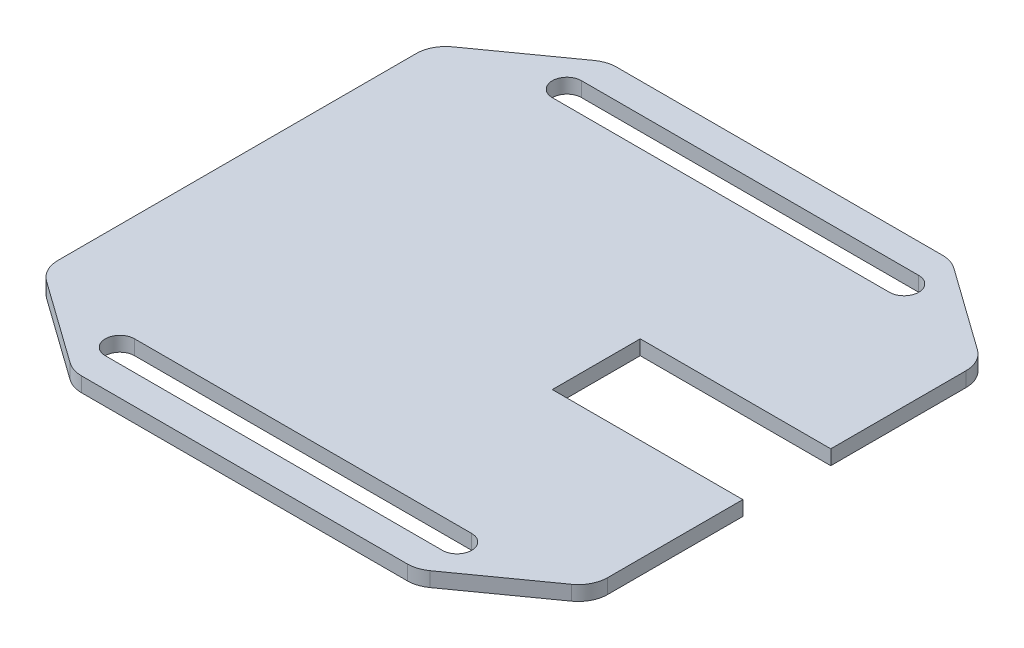
ISO-10303-21;
HEADER;
FILE_DESCRIPTION(('STEP AP214'),'2;1');
FILE_NAME('part.step','',(''),(''),'','','');
FILE_SCHEMA(('AUTOMOTIVE_DESIGN { 1 0 10303 214 1 1 1 1 }'));
ENDSEC;
DATA;
#1=APPLICATION_CONTEXT('core data for automotive mechanical design processes');
#2=APPLICATION_PROTOCOL_DEFINITION('international standard','automotive_design',2000,#1);
#3=PRODUCT_CONTEXT('',#1,'mechanical');
#4=PRODUCT('Part','Part','',(#3));
#5=PRODUCT_RELATED_PRODUCT_CATEGORY('part','',(#4));
#6=PRODUCT_DEFINITION_FORMATION('','',#4);
#7=PRODUCT_DEFINITION_CONTEXT('part definition',#1,'design');
#8=PRODUCT_DEFINITION('design','',#6,#7);
#9=PRODUCT_DEFINITION_SHAPE('','',#8);
#10=(LENGTH_UNIT() NAMED_UNIT(*) SI_UNIT(.MILLI.,.METRE.));
#11=(NAMED_UNIT(*) PLANE_ANGLE_UNIT() SI_UNIT($,.RADIAN.));
#12=(NAMED_UNIT(*) SI_UNIT($,.STERADIAN.) SOLID_ANGLE_UNIT());
#13=UNCERTAINTY_MEASURE_WITH_UNIT(LENGTH_MEASURE(1.E-05),#10,'distance_accuracy_value','');
#14=(GEOMETRIC_REPRESENTATION_CONTEXT(3) GLOBAL_UNCERTAINTY_ASSIGNED_CONTEXT((#13)) GLOBAL_UNIT_ASSIGNED_CONTEXT((#10,
#11,#12)) REPRESENTATION_CONTEXT('',''));
#15=CARTESIAN_POINT('',(0.,0.,0.));
#16=DIRECTION('',(0.,0.,1.));
#17=DIRECTION('',(1.,0.,0.));
#18=AXIS2_PLACEMENT_3D('',#15,#16,#17);
#19=CARTESIAN_POINT('',(18.75,1.,-18.25));
#20=DIRECTION('',(-1.,0.,0.));
#21=DIRECTION('',(0.,0.,1.));
#22=AXIS2_PLACEMENT_3D('',#19,#20,#21);
#23=PLANE('',#22);
#24=DIRECTION('',(0.,0.,-1.));
#25=VECTOR('',#24,1.);
#26=CARTESIAN_POINT('',(18.75,0.,-18.25));
#27=LINE('',#26,#25);
#28=CARTESIAN_POINT('',(18.75,0.,12.2207642094164));
#29=VERTEX_POINT('',#28);
#30=CARTESIAN_POINT('',(18.75,0.,3.));
#31=VERTEX_POINT('',#30);
#32=EDGE_CURVE('E249',#29,#31,#27,.T.);
#33=ORIENTED_EDGE('',*,*,#32,.T.);
#34=DIRECTION('',(0.,1.,0.));
#35=VECTOR('',#34,1.);
#36=CARTESIAN_POINT('',(18.75,0.,3.));
#37=LINE('',#36,#35);
#38=CARTESIAN_POINT('',(18.75,1.,3.));
#39=VERTEX_POINT('',#38);
#40=EDGE_CURVE('E404',#31,#39,#37,.T.);
#41=ORIENTED_EDGE('',*,*,#40,.T.);
#42=DIRECTION('',(0.,0.,-1.));
#43=VECTOR('',#42,1.);
#44=CARTESIAN_POINT('',(18.75,1.,-18.25));
#45=LINE('',#44,#43);
#46=CARTESIAN_POINT('',(18.75,1.,12.2207642094164));
#47=VERTEX_POINT('',#46);
#48=EDGE_CURVE('E364',#47,#39,#45,.T.);
#49=ORIENTED_EDGE('',*,*,#48,.F.);
#50=DIRECTION('',(0.,1.,0.));
#51=VECTOR('',#50,1.);
#52=CARTESIAN_POINT('',(18.75,1.,12.2207642094164));
#53=LINE('',#52,#51);
#54=EDGE_CURVE('E320',#47,#29,#53,.F.);
#55=ORIENTED_EDGE('',*,*,#54,.T.);
#56=EDGE_LOOP('',(#33,#41,#49,#55));
#57=FACE_BOUND('',#56,.T.);
#58=ADVANCED_FACE('F38',(#57),#23,.F.);
#59=CARTESIAN_POINT('',(18.75,1.,-3.));
#60=VERTEX_POINT('',#59);
#61=CARTESIAN_POINT('',(18.75,1.,-12.2207642094164));
#62=VERTEX_POINT('',#61);
#63=EDGE_CURVE('E241',#60,#62,#45,.T.);
#64=ORIENTED_EDGE('',*,*,#63,.F.);
#65=DIRECTION('',(0.,1.,0.));
#66=VECTOR('',#65,1.);
#67=CARTESIAN_POINT('',(18.75,0.,-3.));
#68=LINE('',#67,#66);
#69=CARTESIAN_POINT('',(18.75,0.,-3.));
#70=VERTEX_POINT('',#69);
#71=EDGE_CURVE('E228',#70,#60,#68,.T.);
#72=ORIENTED_EDGE('',*,*,#71,.F.);
#73=CARTESIAN_POINT('',(18.75,0.,-12.2207642094164));
#74=VERTEX_POINT('',#73);
#75=EDGE_CURVE('E239',#70,#74,#27,.T.);
#76=ORIENTED_EDGE('',*,*,#75,.T.);
#77=DIRECTION('',(0.,1.,0.));
#78=VECTOR('',#77,1.);
#79=CARTESIAN_POINT('',(18.75,1.,-12.2207642094164));
#80=LINE('',#79,#78);
#81=EDGE_CURVE('E322',#74,#62,#80,.T.);
#82=ORIENTED_EDGE('',*,*,#81,.T.);
#83=EDGE_LOOP('',(#64,#72,#76,#82));
#84=FACE_BOUND('',#83,.T.);
#85=ADVANCED_FACE('F237',(#84),#23,.F.);
#86=CARTESIAN_POINT('',(-18.75,1.,-18.25));
#87=DIRECTION('',(0.,0.,1.));
#88=DIRECTION('',(1.,0.,0.));
#89=AXIS2_PLACEMENT_3D('',#86,#87,#88);
#90=PLANE('',#89);
#91=DIRECTION('',(-1.,0.,0.));
#92=VECTOR('',#91,1.);
#93=CARTESIAN_POINT('',(-18.75,0.,-18.25));
#94=LINE('',#93,#92);
#95=CARTESIAN_POINT('',(11.1090698931829,0.,-18.25));
#96=VERTEX_POINT('',#95);
#97=CARTESIAN_POINT('',(-11.1090698931829,0.,-18.25));
#98=VERTEX_POINT('',#97);
#99=EDGE_CURVE('E253',#96,#98,#94,.T.);
#100=ORIENTED_EDGE('',*,*,#99,.T.);
#101=DIRECTION('',(0.,1.,0.));
#102=VECTOR('',#101,1.);
#103=CARTESIAN_POINT('',(-11.1090698931829,1.,-18.25));
#104=LINE('',#103,#102);
#105=CARTESIAN_POINT('',(-11.1090698931829,1.,-18.25));
#106=VERTEX_POINT('',#105);
#107=EDGE_CURVE('E312',#98,#106,#104,.T.);
#108=ORIENTED_EDGE('',*,*,#107,.T.);
#109=DIRECTION('',(-1.,0.,0.));
#110=VECTOR('',#109,1.);
#111=CARTESIAN_POINT('',(-18.75,1.,-18.25));
#112=LINE('',#111,#110);
#113=CARTESIAN_POINT('',(11.1090698931829,1.,-18.25));
#114=VERTEX_POINT('',#113);
#115=EDGE_CURVE('E361',#114,#106,#112,.T.);
#116=ORIENTED_EDGE('',*,*,#115,.F.);
#117=DIRECTION('',(0.,1.,0.));
#118=VECTOR('',#117,1.);
#119=CARTESIAN_POINT('',(11.1090698931829,1.,-18.25));
#120=LINE('',#119,#118);
#121=EDGE_CURVE('E310',#114,#96,#120,.F.);
#122=ORIENTED_EDGE('',*,*,#121,.T.);
#123=EDGE_LOOP('',(#100,#108,#116,#122));
#124=FACE_BOUND('',#123,.T.);
#125=ADVANCED_FACE('F492',(#124),#90,.F.);
#126=CARTESIAN_POINT('',(-18.75,1.,-18.25));
#127=DIRECTION('',(1.,0.,0.));
#128=DIRECTION('',(0.,0.,-1.));
#129=AXIS2_PLACEMENT_3D('',#126,#127,#128);
#130=PLANE('',#129);
#131=DIRECTION('',(0.,0.,1.));
#132=VECTOR('',#131,1.);
#133=CARTESIAN_POINT('',(-18.75,1.,-18.25));
#134=LINE('',#133,#132);
#135=CARTESIAN_POINT('',(-18.75,1.,-12.2207642094164));
#136=VERTEX_POINT('',#135);
#137=CARTESIAN_POINT('',(-18.75,1.,12.2207642094164));
#138=VERTEX_POINT('',#137);
#139=EDGE_CURVE('E354',#136,#138,#134,.T.);
#140=ORIENTED_EDGE('',*,*,#139,.F.);
#141=DIRECTION('',(0.,1.,0.));
#142=VECTOR('',#141,1.);
#143=CARTESIAN_POINT('',(-18.75,1.,-12.2207642094164));
#144=LINE('',#143,#142);
#145=CARTESIAN_POINT('',(-18.75,0.,-12.2207642094164));
#146=VERTEX_POINT('',#145);
#147=EDGE_CURVE('E293',#136,#146,#144,.F.);
#148=ORIENTED_EDGE('',*,*,#147,.T.);
#149=DIRECTION('',(0.,0.,1.));
#150=VECTOR('',#149,1.);
#151=CARTESIAN_POINT('',(-18.75,0.,-18.25));
#152=LINE('',#151,#150);
#153=CARTESIAN_POINT('',(-18.75,0.,12.2207642094164));
#154=VERTEX_POINT('',#153);
#155=EDGE_CURVE('E263',#146,#154,#152,.T.);
#156=ORIENTED_EDGE('',*,*,#155,.T.);
#157=DIRECTION('',(0.,1.,0.));
#158=VECTOR('',#157,1.);
#159=CARTESIAN_POINT('',(-18.75,1.,12.2207642094164));
#160=LINE('',#159,#158);
#161=EDGE_CURVE('E290',#154,#138,#160,.T.);
#162=ORIENTED_EDGE('',*,*,#161,.T.);
#163=EDGE_LOOP('',(#140,#148,#156,#162));
#164=FACE_BOUND('',#163,.T.);
#165=ADVANCED_FACE('F353',(#164),#130,.F.);
#166=CARTESIAN_POINT('',(-18.75,1.,18.25));
#167=DIRECTION('',(0.,0.,-1.));
#168=DIRECTION('',(-1.,0.,0.));
#169=AXIS2_PLACEMENT_3D('',#166,#167,#168);
#170=PLANE('',#169);
#171=DIRECTION('',(1.,0.,0.));
#172=VECTOR('',#171,1.);
#173=CARTESIAN_POINT('',(-18.75,0.,18.25));
#174=LINE('',#173,#172);
#175=CARTESIAN_POINT('',(-11.1090698931829,0.,18.25));
#176=VERTEX_POINT('',#175);
#177=CARTESIAN_POINT('',(11.1090698931829,0.,18.25));
#178=VERTEX_POINT('',#177);
#179=EDGE_CURVE('E266',#176,#178,#174,.T.);
#180=ORIENTED_EDGE('',*,*,#179,.T.);
#181=DIRECTION('',(0.,1.,0.));
#182=VECTOR('',#181,1.);
#183=CARTESIAN_POINT('',(11.1090698931829,1.,18.25));
#184=LINE('',#183,#182);
#185=CARTESIAN_POINT('',(11.1090698931829,1.,18.25));
#186=VERTEX_POINT('',#185);
#187=EDGE_CURVE('E330',#178,#186,#184,.T.);
#188=ORIENTED_EDGE('',*,*,#187,.T.);
#189=DIRECTION('',(1.,0.,0.));
#190=VECTOR('',#189,1.);
#191=CARTESIAN_POINT('',(-18.75,1.,18.25));
#192=LINE('',#191,#190);
#193=CARTESIAN_POINT('',(-11.1090698931829,1.,18.25));
#194=VERTEX_POINT('',#193);
#195=EDGE_CURVE('E259',#194,#186,#192,.T.);
#196=ORIENTED_EDGE('',*,*,#195,.F.);
#197=DIRECTION('',(0.,1.,0.));
#198=VECTOR('',#197,1.);
#199=CARTESIAN_POINT('',(-11.1090698931829,1.,18.25));
#200=LINE('',#199,#198);
#201=EDGE_CURVE('E328',#194,#176,#200,.F.);
#202=ORIENTED_EDGE('',*,*,#201,.T.);
#203=EDGE_LOOP('',(#180,#188,#196,#202));
#204=FACE_BOUND('',#203,.T.);
#205=ADVANCED_FACE('F476',(#204),#170,.F.);
#206=CARTESIAN_POINT('',(0.,1.,0.));
#207=DIRECTION('',(0.,1.,0.));
#208=DIRECTION('',(0.,0.,1.));
#209=AXIS2_PLACEMENT_3D('',#206,#207,#208);
#210=PLANE('',#209);
#211=DIRECTION('',(1.,0.,0.));
#212=VECTOR('',#211,1.);
#213=CARTESIAN_POINT('',(5.75,1.,3.));
#214=LINE('',#213,#212);
#215=CARTESIAN_POINT('',(5.75,1.,3.));
#216=VERTEX_POINT('',#215);
#217=EDGE_CURVE('E233',#216,#39,#214,.T.);
#218=ORIENTED_EDGE('',*,*,#217,.F.);
#219=DIRECTION('',(0.,0.,1.));
#220=VECTOR('',#219,1.);
#221=CARTESIAN_POINT('',(5.75,1.,-3.));
#222=LINE('',#221,#220);
#223=CARTESIAN_POINT('',(5.75,1.,-3.));
#224=VERTEX_POINT('',#223);
#225=EDGE_CURVE('E451',#224,#216,#222,.T.);
#226=ORIENTED_EDGE('',*,*,#225,.F.);
#227=DIRECTION('',(-1.,0.,0.));
#228=VECTOR('',#227,1.);
#229=CARTESIAN_POINT('',(5.75,1.,-3.));
#230=LINE('',#229,#228);
#231=EDGE_CURVE('E454',#60,#224,#230,.T.);
#232=ORIENTED_EDGE('',*,*,#231,.F.);
#233=ORIENTED_EDGE('',*,*,#63,.T.);
#234=CARTESIAN_POINT('',(16.75,1.,-12.2207642094164));
#235=DIRECTION('',(0.,1.,0.));
#236=DIRECTION('',(0.,0.,1.));
#237=AXIS2_PLACEMENT_3D('',#234,#235,#236);
#238=CIRCLE('',#237,2.);
#239=CARTESIAN_POINT('',(17.9124763874382,1.,-13.8482311518299));
#240=VERTEX_POINT('',#239);
#241=EDGE_CURVE('E282',#62,#240,#238,.T.);
#242=ORIENTED_EDGE('',*,*,#241,.T.);
#243=DIRECTION('',(0.813733471206735,0.,0.581238193719096));
#244=VECTOR('',#243,1.);
#245=CARTESIAN_POINT('',(11.75,1.,-18.25));
#246=LINE('',#245,#244);
#247=CARTESIAN_POINT('',(12.2715462806211,1.,-17.8774669424135));
#248=VERTEX_POINT('',#247);
#249=EDGE_CURVE('E377',#248,#240,#246,.T.);
#250=ORIENTED_EDGE('',*,*,#249,.F.);
#251=CARTESIAN_POINT('',(11.1090698931829,1.,-16.25));
#252=DIRECTION('',(0.,1.,0.));
#253=DIRECTION('',(0.,0.,1.));
#254=AXIS2_PLACEMENT_3D('',#251,#252,#253);
#255=CIRCLE('',#254,2.);
#256=EDGE_CURVE('E284',#248,#114,#255,.T.);
#257=ORIENTED_EDGE('',*,*,#256,.T.);
#258=ORIENTED_EDGE('',*,*,#115,.T.);
#259=CARTESIAN_POINT('',(-11.1090698931829,1.,-16.25));
#260=DIRECTION('',(0.,1.,0.));
#261=DIRECTION('',(0.,0.,1.));
#262=AXIS2_PLACEMENT_3D('',#259,#260,#261);
#263=CIRCLE('',#262,2.);
#264=CARTESIAN_POINT('',(-12.2715462806211,1.,-17.8774669424135));
#265=VERTEX_POINT('',#264);
#266=EDGE_CURVE('E286',#106,#265,#263,.T.);
#267=ORIENTED_EDGE('',*,*,#266,.T.);
#268=DIRECTION('',(0.813733471206735,0.,-0.581238193719096));
#269=VECTOR('',#268,1.);
#270=CARTESIAN_POINT('',(-11.75,1.,-18.25));
#271=LINE('',#270,#269);
#272=CARTESIAN_POINT('',(-17.9124763874382,1.,-13.8482311518299));
#273=VERTEX_POINT('',#272);
#274=EDGE_CURVE('E255',#273,#265,#271,.T.);
#275=ORIENTED_EDGE('',*,*,#274,.F.);
#276=CARTESIAN_POINT('',(-16.75,1.,-12.2207642094164));
#277=DIRECTION('',(0.,1.,0.));
#278=DIRECTION('',(0.,0.,1.));
#279=AXIS2_PLACEMENT_3D('',#276,#277,#278);
#280=CIRCLE('',#279,2.);
#281=EDGE_CURVE('E288',#273,#136,#280,.T.);
#282=ORIENTED_EDGE('',*,*,#281,.T.);
#283=ORIENTED_EDGE('',*,*,#139,.T.);
#284=CARTESIAN_POINT('',(-16.75,1.,12.2207642094164));
#285=DIRECTION('',(0.,1.,0.));
#286=DIRECTION('',(0.,0.,1.));
#287=AXIS2_PLACEMENT_3D('',#284,#285,#286);
#288=CIRCLE('',#287,2.);
#289=CARTESIAN_POINT('',(-17.9124763874382,1.,13.8482311518299));
#290=VERTEX_POINT('',#289);
#291=EDGE_CURVE('E274',#138,#290,#288,.T.);
#292=ORIENTED_EDGE('',*,*,#291,.T.);
#293=DIRECTION('',(-0.813733471206735,0.,-0.581238193719096));
#294=VECTOR('',#293,1.);
#295=CARTESIAN_POINT('',(-11.75,1.,18.25));
#296=LINE('',#295,#294);
#297=CARTESIAN_POINT('',(-12.2715462806211,1.,17.8774669424135));
#298=VERTEX_POINT('',#297);
#299=EDGE_CURVE('E341',#298,#290,#296,.T.);
#300=ORIENTED_EDGE('',*,*,#299,.F.);
#301=CARTESIAN_POINT('',(-11.1090698931829,1.,16.25));
#302=DIRECTION('',(0.,1.,0.));
#303=DIRECTION('',(0.,0.,1.));
#304=AXIS2_PLACEMENT_3D('',#301,#302,#303);
#305=CIRCLE('',#304,2.);
#306=EDGE_CURVE('E276',#298,#194,#305,.T.);
#307=ORIENTED_EDGE('',*,*,#306,.T.);
#308=ORIENTED_EDGE('',*,*,#195,.T.);
#309=CARTESIAN_POINT('',(11.1090698931829,1.,16.25));
#310=DIRECTION('',(0.,1.,0.));
#311=DIRECTION('',(0.,0.,1.));
#312=AXIS2_PLACEMENT_3D('',#309,#310,#311);
#313=CIRCLE('',#312,2.);
#314=CARTESIAN_POINT('',(12.2715462806211,1.,17.8774669424135));
#315=VERTEX_POINT('',#314);
#316=EDGE_CURVE('E278',#186,#315,#313,.T.);
#317=ORIENTED_EDGE('',*,*,#316,.T.);
#318=DIRECTION('',(-0.813733471206735,0.,0.581238193719096));
#319=VECTOR('',#318,1.);
#320=CARTESIAN_POINT('',(11.75,1.,18.25));
#321=LINE('',#320,#319);
#322=CARTESIAN_POINT('',(17.9124763874382,1.,13.8482311518299));
#323=VERTEX_POINT('',#322);
#324=EDGE_CURVE('E347',#323,#315,#321,.T.);
#325=ORIENTED_EDGE('',*,*,#324,.F.);
#326=CARTESIAN_POINT('',(16.75,1.,12.2207642094164));
#327=DIRECTION('',(0.,1.,0.));
#328=DIRECTION('',(0.,0.,1.));
#329=AXIS2_PLACEMENT_3D('',#326,#327,#328);
#330=CIRCLE('',#329,2.);
#331=EDGE_CURVE('E280',#323,#47,#330,.T.);
#332=ORIENTED_EDGE('',*,*,#331,.T.);
#333=ORIENTED_EDGE('',*,*,#48,.T.);
#334=EDGE_LOOP('',(#218,#226,#232,#233,#242,#250,#257,#258,#267,#275,#282,#283,#292,#300,#307,
#308,#317,#325,#332,#333));
#335=FACE_BOUND('',#334,.T.);
#336=CARTESIAN_POINT('',(-11.5,1.,-15.25));
#337=DIRECTION('',(0.,1.,0.));
#338=DIRECTION('',(0.,0.,1.));
#339=AXIS2_PLACEMENT_3D('',#336,#337,#338);
#340=CIRCLE('',#339,0.999999999999997);
#341=CARTESIAN_POINT('',(-11.5,1.,-16.25));
#342=VERTEX_POINT('',#341);
#343=CARTESIAN_POINT('',(-11.5,1.,-14.25));
#344=VERTEX_POINT('',#343);
#345=EDGE_CURVE('E391',#342,#344,#340,.T.);
#346=ORIENTED_EDGE('',*,*,#345,.F.);
#347=DIRECTION('',(-1.,0.,0.));
#348=VECTOR('',#347,1.);
#349=CARTESIAN_POINT('',(-11.5,1.,-16.25));
#350=LINE('',#349,#348);
#351=CARTESIAN_POINT('',(11.5,1.,-16.25));
#352=VERTEX_POINT('',#351);
#353=EDGE_CURVE('E424',#352,#342,#350,.T.);
#354=ORIENTED_EDGE('',*,*,#353,.F.);
#355=CARTESIAN_POINT('',(11.5,1.,-15.25));
#356=DIRECTION('',(0.,1.,0.));
#357=DIRECTION('',(0.,0.,1.));
#358=AXIS2_PLACEMENT_3D('',#355,#356,#357);
#359=CIRCLE('',#358,0.999999999999997);
#360=CARTESIAN_POINT('',(11.5,1.,-14.25));
#361=VERTEX_POINT('',#360);
#362=EDGE_CURVE('E428',#361,#352,#359,.T.);
#363=ORIENTED_EDGE('',*,*,#362,.F.);
#364=DIRECTION('',(1.,0.,0.));
#365=VECTOR('',#364,1.);
#366=CARTESIAN_POINT('',(-11.5,1.,-14.25));
#367=LINE('',#366,#365);
#368=EDGE_CURVE('E431',#344,#361,#367,.T.);
#369=ORIENTED_EDGE('',*,*,#368,.F.);
#370=EDGE_LOOP('',(#346,#354,#363,#369));
#371=FACE_BOUND('',#370,.T.);
#372=CARTESIAN_POINT('',(-11.5,1.,15.25));
#373=DIRECTION('',(0.,1.,0.));
#374=DIRECTION('',(0.,0.,-1.));
#375=AXIS2_PLACEMENT_3D('',#372,#373,#374);
#376=CIRCLE('',#375,0.999999999999997);
#377=CARTESIAN_POINT('',(-11.5,1.,14.25));
#378=VERTEX_POINT('',#377);
#379=CARTESIAN_POINT('',(-11.5,1.,16.25));
#380=VERTEX_POINT('',#379);
#381=EDGE_CURVE('E402',#378,#380,#376,.T.);
#382=ORIENTED_EDGE('',*,*,#381,.F.);
#383=DIRECTION('',(-1.,0.,0.));
#384=VECTOR('',#383,1.);
#385=CARTESIAN_POINT('',(-11.5,1.,14.25));
#386=LINE('',#385,#384);
#387=CARTESIAN_POINT('',(11.5,1.,14.25));
#388=VERTEX_POINT('',#387);
#389=EDGE_CURVE('E392',#388,#378,#386,.T.);
#390=ORIENTED_EDGE('',*,*,#389,.F.);
#391=CARTESIAN_POINT('',(11.5,1.,15.25));
#392=DIRECTION('',(0.,1.,0.));
#393=DIRECTION('',(0.,0.,-1.));
#394=AXIS2_PLACEMENT_3D('',#391,#392,#393);
#395=CIRCLE('',#394,0.999999999999997);
#396=CARTESIAN_POINT('',(11.5,1.,16.25));
#397=VERTEX_POINT('',#396);
#398=EDGE_CURVE('E396',#397,#388,#395,.T.);
#399=ORIENTED_EDGE('',*,*,#398,.F.);
#400=DIRECTION('',(1.,0.,0.));
#401=VECTOR('',#400,1.);
#402=CARTESIAN_POINT('',(-11.5,1.,16.25));
#403=LINE('',#402,#401);
#404=EDGE_CURVE('E399',#380,#397,#403,.T.);
#405=ORIENTED_EDGE('',*,*,#404,.F.);
#406=EDGE_LOOP('',(#382,#390,#399,#405));
#407=FACE_BOUND('',#406,.T.);
#408=ADVANCED_FACE('F358',(#335,#371,#407),#210,.T.);
#409=CARTESIAN_POINT('',(0.,0.,0.));
#410=DIRECTION('',(0.,1.,0.));
#411=DIRECTION('',(0.,0.,1.));
#412=AXIS2_PLACEMENT_3D('',#409,#410,#411);
#413=PLANE('',#412);
#414=DIRECTION('',(-1.,0.,0.));
#415=VECTOR('',#414,1.);
#416=CARTESIAN_POINT('',(-11.5,0.,-16.25));
#417=LINE('',#416,#415);
#418=CARTESIAN_POINT('',(11.5,0.,-16.25));
#419=VERTEX_POINT('',#418);
#420=CARTESIAN_POINT('',(-11.5,0.,-16.25));
#421=VERTEX_POINT('',#420);
#422=EDGE_CURVE('E419',#419,#421,#417,.T.);
#423=ORIENTED_EDGE('',*,*,#422,.T.);
#424=CARTESIAN_POINT('',(-11.5,0.,-15.25));
#425=DIRECTION('',(0.,1.,0.));
#426=DIRECTION('',(0.,0.,1.));
#427=AXIS2_PLACEMENT_3D('',#424,#425,#426);
#428=CIRCLE('',#427,0.999999999999997);
#429=CARTESIAN_POINT('',(-11.5,0.,-14.25));
#430=VERTEX_POINT('',#429);
#431=EDGE_CURVE('E427',#421,#430,#428,.T.);
#432=ORIENTED_EDGE('',*,*,#431,.T.);
#433=DIRECTION('',(1.,0.,0.));
#434=VECTOR('',#433,1.);
#435=CARTESIAN_POINT('',(-11.5,0.,-14.25));
#436=LINE('',#435,#434);
#437=CARTESIAN_POINT('',(11.5,0.,-14.25));
#438=VERTEX_POINT('',#437);
#439=EDGE_CURVE('E440',#430,#438,#436,.T.);
#440=ORIENTED_EDGE('',*,*,#439,.T.);
#441=CARTESIAN_POINT('',(11.5,0.,-15.25));
#442=DIRECTION('',(0.,1.,0.));
#443=DIRECTION('',(0.,0.,1.));
#444=AXIS2_PLACEMENT_3D('',#441,#442,#443);
#445=CIRCLE('',#444,0.999999999999997);
#446=EDGE_CURVE('E437',#438,#419,#445,.T.);
#447=ORIENTED_EDGE('',*,*,#446,.T.);
#448=EDGE_LOOP('',(#423,#432,#440,#447));
#449=FACE_BOUND('',#448,.T.);
#450=DIRECTION('',(-1.,0.,0.));
#451=VECTOR('',#450,1.);
#452=CARTESIAN_POINT('',(-11.5,0.,14.25));
#453=LINE('',#452,#451);
#454=CARTESIAN_POINT('',(11.5,0.,14.25));
#455=VERTEX_POINT('',#454);
#456=CARTESIAN_POINT('',(-11.5,0.,14.25));
#457=VERTEX_POINT('',#456);
#458=EDGE_CURVE('E385',#455,#457,#453,.T.);
#459=ORIENTED_EDGE('',*,*,#458,.T.);
#460=CARTESIAN_POINT('',(-11.5,0.,15.25));
#461=DIRECTION('',(0.,1.,0.));
#462=DIRECTION('',(0.,0.,-1.));
#463=AXIS2_PLACEMENT_3D('',#460,#461,#462);
#464=CIRCLE('',#463,0.999999999999997);
#465=CARTESIAN_POINT('',(-11.5,0.,16.25));
#466=VERTEX_POINT('',#465);
#467=EDGE_CURVE('E395',#457,#466,#464,.T.);
#468=ORIENTED_EDGE('',*,*,#467,.T.);
#469=DIRECTION('',(1.,0.,0.));
#470=VECTOR('',#469,1.);
#471=CARTESIAN_POINT('',(-11.5,0.,16.25));
#472=LINE('',#471,#470);
#473=CARTESIAN_POINT('',(11.5,0.,16.25));
#474=VERTEX_POINT('',#473);
#475=EDGE_CURVE('E410',#466,#474,#472,.T.);
#476=ORIENTED_EDGE('',*,*,#475,.T.);
#477=CARTESIAN_POINT('',(11.5,0.,15.25));
#478=DIRECTION('',(0.,1.,0.));
#479=DIRECTION('',(0.,0.,-1.));
#480=AXIS2_PLACEMENT_3D('',#477,#478,#479);
#481=CIRCLE('',#480,0.999999999999997);
#482=EDGE_CURVE('E407',#474,#455,#481,.T.);
#483=ORIENTED_EDGE('',*,*,#482,.T.);
#484=EDGE_LOOP('',(#459,#468,#476,#483));
#485=FACE_BOUND('',#484,.T.);
#486=DIRECTION('',(0.,0.,1.));
#487=VECTOR('',#486,1.);
#488=CARTESIAN_POINT('',(5.75,0.,-3.));
#489=LINE('',#488,#487);
#490=CARTESIAN_POINT('',(5.75,0.,-3.));
#491=VERTEX_POINT('',#490);
#492=CARTESIAN_POINT('',(5.75,0.,3.));
#493=VERTEX_POINT('',#492);
#494=EDGE_CURVE('E53',#491,#493,#489,.T.);
#495=ORIENTED_EDGE('',*,*,#494,.T.);
#496=DIRECTION('',(1.,0.,0.));
#497=VECTOR('',#496,1.);
#498=CARTESIAN_POINT('',(5.75,0.,3.));
#499=LINE('',#498,#497);
#500=EDGE_CURVE('E242',#493,#31,#499,.T.);
#501=ORIENTED_EDGE('',*,*,#500,.T.);
#502=ORIENTED_EDGE('',*,*,#32,.F.);
#503=CARTESIAN_POINT('',(16.75,0.,12.2207642094164));
#504=DIRECTION('',(0.,1.,0.));
#505=DIRECTION('',(0.,0.,1.));
#506=AXIS2_PLACEMENT_3D('',#503,#504,#505);
#507=CIRCLE('',#506,2.);
#508=CARTESIAN_POINT('',(17.9124763874382,0.,13.8482311518299));
#509=VERTEX_POINT('',#508);
#510=EDGE_CURVE('E301',#29,#509,#507,.F.);
#511=ORIENTED_EDGE('',*,*,#510,.T.);
#512=DIRECTION('',(-0.813733471206735,0.,0.581238193719096));
#513=VECTOR('',#512,1.);
#514=CARTESIAN_POINT('',(11.75,0.,18.25));
#515=LINE('',#514,#513);
#516=CARTESIAN_POINT('',(12.2715462806211,0.,17.8774669424135));
#517=VERTEX_POINT('',#516);
#518=EDGE_CURVE('E375',#509,#517,#515,.T.);
#519=ORIENTED_EDGE('',*,*,#518,.T.);
#520=CARTESIAN_POINT('',(11.1090698931829,0.,16.25));
#521=DIRECTION('',(0.,1.,0.));
#522=DIRECTION('',(0.,0.,1.));
#523=AXIS2_PLACEMENT_3D('',#520,#521,#522);
#524=CIRCLE('',#523,2.);
#525=EDGE_CURVE('E299',#517,#178,#524,.F.);
#526=ORIENTED_EDGE('',*,*,#525,.T.);
#527=ORIENTED_EDGE('',*,*,#179,.F.);
#528=CARTESIAN_POINT('',(-11.1090698931829,0.,16.25));
#529=DIRECTION('',(0.,1.,0.));
#530=DIRECTION('',(0.,0.,1.));
#531=AXIS2_PLACEMENT_3D('',#528,#529,#530);
#532=CIRCLE('',#531,2.);
#533=CARTESIAN_POINT('',(-12.2715462806211,0.,17.8774669424135));
#534=VERTEX_POINT('',#533);
#535=EDGE_CURVE('E297',#176,#534,#532,.F.);
#536=ORIENTED_EDGE('',*,*,#535,.T.);
#537=DIRECTION('',(-0.813733471206735,0.,-0.581238193719096));
#538=VECTOR('',#537,1.);
#539=CARTESIAN_POINT('',(-11.75,0.,18.25));
#540=LINE('',#539,#538);
#541=CARTESIAN_POINT('',(-17.9124763874382,0.,13.8482311518299));
#542=VERTEX_POINT('',#541);
#543=EDGE_CURVE('E338',#534,#542,#540,.T.);
#544=ORIENTED_EDGE('',*,*,#543,.T.);
#545=CARTESIAN_POINT('',(-16.75,0.,12.2207642094164));
#546=DIRECTION('',(0.,1.,0.));
#547=DIRECTION('',(0.,0.,1.));
#548=AXIS2_PLACEMENT_3D('',#545,#546,#547);
#549=CIRCLE('',#548,2.);
#550=EDGE_CURVE('E295',#542,#154,#549,.F.);
#551=ORIENTED_EDGE('',*,*,#550,.T.);
#552=ORIENTED_EDGE('',*,*,#155,.F.);
#553=CARTESIAN_POINT('',(-16.75,0.,-12.2207642094164));
#554=DIRECTION('',(0.,1.,0.));
#555=DIRECTION('',(0.,0.,1.));
#556=AXIS2_PLACEMENT_3D('',#553,#554,#555);
#557=CIRCLE('',#556,2.);
#558=CARTESIAN_POINT('',(-17.9124763874382,0.,-13.8482311518299));
#559=VERTEX_POINT('',#558);
#560=EDGE_CURVE('E308',#146,#559,#557,.F.);
#561=ORIENTED_EDGE('',*,*,#560,.T.);
#562=DIRECTION('',(0.813733471206735,0.,-0.581238193719096));
#563=VECTOR('',#562,1.);
#564=CARTESIAN_POINT('',(-11.75,0.,-18.25));
#565=LINE('',#564,#563);
#566=CARTESIAN_POINT('',(-12.2715462806211,0.,-17.8774669424135));
#567=VERTEX_POINT('',#566);
#568=EDGE_CURVE('E250',#559,#567,#565,.T.);
#569=ORIENTED_EDGE('',*,*,#568,.T.);
#570=CARTESIAN_POINT('',(-11.1090698931829,0.,-16.25));
#571=DIRECTION('',(0.,1.,0.));
#572=DIRECTION('',(0.,0.,1.));
#573=AXIS2_PLACEMENT_3D('',#570,#571,#572);
#574=CIRCLE('',#573,2.);
#575=EDGE_CURVE('E306',#567,#98,#574,.F.);
#576=ORIENTED_EDGE('',*,*,#575,.T.);
#577=ORIENTED_EDGE('',*,*,#99,.F.);
#578=CARTESIAN_POINT('',(11.1090698931829,0.,-16.25));
#579=DIRECTION('',(0.,1.,0.));
#580=DIRECTION('',(0.,0.,1.));
#581=AXIS2_PLACEMENT_3D('',#578,#579,#580);
#582=CIRCLE('',#581,2.);
#583=CARTESIAN_POINT('',(12.2715462806211,0.,-17.8774669424135));
#584=VERTEX_POINT('',#583);
#585=EDGE_CURVE('E304',#96,#584,#582,.F.);
#586=ORIENTED_EDGE('',*,*,#585,.T.);
#587=DIRECTION('',(0.813733471206735,0.,0.581238193719096));
#588=VECTOR('',#587,1.);
#589=CARTESIAN_POINT('',(11.75,0.,-18.25));
#590=LINE('',#589,#588);
#591=CARTESIAN_POINT('',(17.9124763874382,0.,-13.8482311518299));
#592=VERTEX_POINT('',#591);
#593=EDGE_CURVE('E370',#584,#592,#590,.T.);
#594=ORIENTED_EDGE('',*,*,#593,.T.);
#595=CARTESIAN_POINT('',(16.75,0.,-12.2207642094164));
#596=DIRECTION('',(0.,1.,0.));
#597=DIRECTION('',(0.,0.,1.));
#598=AXIS2_PLACEMENT_3D('',#595,#596,#597);
#599=CIRCLE('',#598,2.);
#600=EDGE_CURVE('E247',#592,#74,#599,.F.);
#601=ORIENTED_EDGE('',*,*,#600,.T.);
#602=ORIENTED_EDGE('',*,*,#75,.F.);
#603=DIRECTION('',(-1.,0.,0.));
#604=VECTOR('',#603,1.);
#605=CARTESIAN_POINT('',(5.75,0.,-3.));
#606=LINE('',#605,#604);
#607=EDGE_CURVE('E224',#70,#491,#606,.T.);
#608=ORIENTED_EDGE('',*,*,#607,.T.);
#609=EDGE_LOOP('',(#495,#501,#502,#511,#519,#526,#527,#536,#544,#551,#552,#561,#569,#576,#577,
#586,#594,#601,#602,#608));
#610=FACE_BOUND('',#609,.T.);
#611=ADVANCED_FACE('F244',(#449,#485,#610),#413,.F.);
#612=CARTESIAN_POINT('',(-11.75,0.,-18.25));
#613=DIRECTION('',(0.581238193719096,0.,0.813733471206735));
#614=DIRECTION('',(0.813733471206735,0.,-0.581238193719096));
#615=AXIS2_PLACEMENT_3D('',#612,#613,#614);
#616=PLANE('',#615);
#617=ORIENTED_EDGE('',*,*,#568,.F.);
#618=DIRECTION('',(0.,1.,0.));
#619=VECTOR('',#618,1.);
#620=CARTESIAN_POINT('',(-17.9124763874382,0.,-13.8482311518299));
#621=LINE('',#620,#619);
#622=EDGE_CURVE('E271',#559,#273,#621,.T.);
#623=ORIENTED_EDGE('',*,*,#622,.T.);
#624=ORIENTED_EDGE('',*,*,#274,.T.);
#625=DIRECTION('',(0.,1.,0.));
#626=VECTOR('',#625,1.);
#627=CARTESIAN_POINT('',(-12.2715462806211,0.,-17.8774669424135));
#628=LINE('',#627,#626);
#629=EDGE_CURVE('E269',#265,#567,#628,.F.);
#630=ORIENTED_EDGE('',*,*,#629,.T.);
#631=EDGE_LOOP('',(#617,#623,#624,#630));
#632=FACE_BOUND('',#631,.T.);
#633=ADVANCED_FACE('F565',(#632),#616,.F.);
#634=CARTESIAN_POINT('',(11.75,0.,-18.25));
#635=DIRECTION('',(-0.581238193719096,0.,0.813733471206735));
#636=DIRECTION('',(0.813733471206735,0.,0.581238193719096));
#637=AXIS2_PLACEMENT_3D('',#634,#635,#636);
#638=PLANE('',#637);
#639=ORIENTED_EDGE('',*,*,#593,.F.);
#640=DIRECTION('',(0.,1.,0.));
#641=VECTOR('',#640,1.);
#642=CARTESIAN_POINT('',(12.2715462806211,0.,-17.8774669424135));
#643=LINE('',#642,#641);
#644=EDGE_CURVE('E317',#584,#248,#643,.T.);
#645=ORIENTED_EDGE('',*,*,#644,.T.);
#646=ORIENTED_EDGE('',*,*,#249,.T.);
#647=DIRECTION('',(0.,1.,0.));
#648=VECTOR('',#647,1.);
#649=CARTESIAN_POINT('',(17.9124763874382,0.,-13.8482311518299));
#650=LINE('',#649,#648);
#651=EDGE_CURVE('E315',#240,#592,#650,.F.);
#652=ORIENTED_EDGE('',*,*,#651,.T.);
#653=EDGE_LOOP('',(#639,#645,#646,#652));
#654=FACE_BOUND('',#653,.T.);
#655=ADVANCED_FACE('F627',(#654),#638,.F.);
#656=CARTESIAN_POINT('',(11.75,0.,18.25));
#657=DIRECTION('',(-0.581238193719096,0.,-0.813733471206735));
#658=DIRECTION('',(-0.813733471206735,0.,0.581238193719096));
#659=AXIS2_PLACEMENT_3D('',#656,#657,#658);
#660=PLANE('',#659);
#661=ORIENTED_EDGE('',*,*,#518,.F.);
#662=DIRECTION('',(0.,1.,0.));
#663=VECTOR('',#662,1.);
#664=CARTESIAN_POINT('',(17.9124763874382,0.,13.8482311518299));
#665=LINE('',#664,#663);
#666=EDGE_CURVE('E325',#509,#323,#665,.T.);
#667=ORIENTED_EDGE('',*,*,#666,.T.);
#668=ORIENTED_EDGE('',*,*,#324,.T.);
#669=DIRECTION('',(0.,1.,0.));
#670=VECTOR('',#669,1.);
#671=CARTESIAN_POINT('',(12.2715462806211,0.,17.8774669424135));
#672=LINE('',#671,#670);
#673=EDGE_CURVE('E61',#315,#517,#672,.F.);
#674=ORIENTED_EDGE('',*,*,#673,.T.);
#675=EDGE_LOOP('',(#661,#667,#668,#674));
#676=FACE_BOUND('',#675,.T.);
#677=ADVANCED_FACE('F469',(#676),#660,.F.);
#678=CARTESIAN_POINT('',(-11.75,0.,18.25));
#679=DIRECTION('',(0.581238193719096,0.,-0.813733471206735));
#680=DIRECTION('',(-0.813733471206735,0.,-0.581238193719096));
#681=AXIS2_PLACEMENT_3D('',#678,#679,#680);
#682=PLANE('',#681);
#683=ORIENTED_EDGE('',*,*,#543,.F.);
#684=DIRECTION('',(0.,1.,0.));
#685=VECTOR('',#684,1.);
#686=CARTESIAN_POINT('',(-12.2715462806211,0.,17.8774669424135));
#687=LINE('',#686,#685);
#688=EDGE_CURVE('E11',#534,#298,#687,.T.);
#689=ORIENTED_EDGE('',*,*,#688,.T.);
#690=ORIENTED_EDGE('',*,*,#299,.T.);
#691=DIRECTION('',(0.,1.,0.));
#692=VECTOR('',#691,1.);
#693=CARTESIAN_POINT('',(-17.9124763874382,0.,13.8482311518299));
#694=LINE('',#693,#692);
#695=EDGE_CURVE('E46',#290,#542,#694,.F.);
#696=ORIENTED_EDGE('',*,*,#695,.T.);
#697=EDGE_LOOP('',(#683,#689,#690,#696));
#698=FACE_BOUND('',#697,.T.);
#699=ADVANCED_FACE('F337',(#698),#682,.F.);
#700=CARTESIAN_POINT('',(-11.5,0.,15.25));
#701=DIRECTION('',(0.,1.,0.));
#702=DIRECTION('',(0.,0.,1.));
#703=AXIS2_PLACEMENT_3D('',#700,#701,#702);
#704=CYLINDRICAL_SURFACE('',#703,0.999999999999997);
#705=ORIENTED_EDGE('',*,*,#381,.T.);
#706=DIRECTION('',(0.,1.,0.));
#707=VECTOR('',#706,1.);
#708=CARTESIAN_POINT('',(-11.5,0.,16.25));
#709=LINE('',#708,#707);
#710=EDGE_CURVE('E381',#466,#380,#709,.T.);
#711=ORIENTED_EDGE('',*,*,#710,.F.);
#712=ORIENTED_EDGE('',*,*,#467,.F.);
#713=DIRECTION('',(0.,1.,0.));
#714=VECTOR('',#713,1.);
#715=CARTESIAN_POINT('',(-11.5,0.,14.25));
#716=LINE('',#715,#714);
#717=EDGE_CURVE('E389',#457,#378,#716,.T.);
#718=ORIENTED_EDGE('',*,*,#717,.T.);
#719=EDGE_LOOP('',(#705,#711,#712,#718));
#720=FACE_BOUND('',#719,.T.);
#721=ADVANCED_FACE('F616',(#720),#704,.F.);
#722=CARTESIAN_POINT('',(-11.5,0.,14.25));
#723=DIRECTION('',(0.,0.,-1.));
#724=DIRECTION('',(-1.,0.,0.));
#725=AXIS2_PLACEMENT_3D('',#722,#723,#724);
#726=PLANE('',#725);
#727=ORIENTED_EDGE('',*,*,#389,.T.);
#728=ORIENTED_EDGE('',*,*,#717,.F.);
#729=ORIENTED_EDGE('',*,*,#458,.F.);
#730=DIRECTION('',(0.,1.,0.));
#731=VECTOR('',#730,1.);
#732=CARTESIAN_POINT('',(11.5,0.,14.25));
#733=LINE('',#732,#731);
#734=EDGE_CURVE('E387',#455,#388,#733,.T.);
#735=ORIENTED_EDGE('',*,*,#734,.T.);
#736=EDGE_LOOP('',(#727,#728,#729,#735));
#737=FACE_BOUND('',#736,.T.);
#738=ADVANCED_FACE('F612',(#737),#726,.F.);
#739=CARTESIAN_POINT('',(11.5,0.,15.25));
#740=DIRECTION('',(0.,1.,0.));
#741=DIRECTION('',(0.,0.,1.));
#742=AXIS2_PLACEMENT_3D('',#739,#740,#741);
#743=CYLINDRICAL_SURFACE('',#742,0.999999999999997);
#744=ORIENTED_EDGE('',*,*,#398,.T.);
#745=ORIENTED_EDGE('',*,*,#734,.F.);
#746=ORIENTED_EDGE('',*,*,#482,.F.);
#747=DIRECTION('',(0.,1.,0.));
#748=VECTOR('',#747,1.);
#749=CARTESIAN_POINT('',(11.5,0.,16.25));
#750=LINE('',#749,#748);
#751=EDGE_CURVE('E384',#474,#397,#750,.T.);
#752=ORIENTED_EDGE('',*,*,#751,.T.);
#753=EDGE_LOOP('',(#744,#745,#746,#752));
#754=FACE_BOUND('',#753,.T.);
#755=ADVANCED_FACE('F615',(#754),#743,.F.);
#756=CARTESIAN_POINT('',(-11.5,0.,16.25));
#757=DIRECTION('',(0.,0.,1.));
#758=DIRECTION('',(1.,0.,0.));
#759=AXIS2_PLACEMENT_3D('',#756,#757,#758);
#760=PLANE('',#759);
#761=ORIENTED_EDGE('',*,*,#404,.T.);
#762=ORIENTED_EDGE('',*,*,#751,.F.);
#763=ORIENTED_EDGE('',*,*,#475,.F.);
#764=ORIENTED_EDGE('',*,*,#710,.T.);
#765=EDGE_LOOP('',(#761,#762,#763,#764));
#766=FACE_BOUND('',#765,.T.);
#767=ADVANCED_FACE('F610',(#766),#760,.F.);
#768=CARTESIAN_POINT('',(-11.5,0.,-15.25));
#769=DIRECTION('',(0.,1.,0.));
#770=DIRECTION('',(0.,0.,1.));
#771=AXIS2_PLACEMENT_3D('',#768,#769,#770);
#772=CYLINDRICAL_SURFACE('',#771,0.999999999999997);
#773=ORIENTED_EDGE('',*,*,#345,.T.);
#774=DIRECTION('',(0.,1.,0.));
#775=VECTOR('',#774,1.);
#776=CARTESIAN_POINT('',(-11.5,0.,-14.25));
#777=LINE('',#776,#775);
#778=EDGE_CURVE('E415',#430,#344,#777,.T.);
#779=ORIENTED_EDGE('',*,*,#778,.F.);
#780=ORIENTED_EDGE('',*,*,#431,.F.);
#781=DIRECTION('',(0.,1.,0.));
#782=VECTOR('',#781,1.);
#783=CARTESIAN_POINT('',(-11.5,0.,-16.25));
#784=LINE('',#783,#782);
#785=EDGE_CURVE('E372',#421,#342,#784,.T.);
#786=ORIENTED_EDGE('',*,*,#785,.T.);
#787=EDGE_LOOP('',(#773,#779,#780,#786));
#788=FACE_BOUND('',#787,.T.);
#789=ADVANCED_FACE('F600',(#788),#772,.F.);
#790=CARTESIAN_POINT('',(-11.5,0.,-16.25));
#791=DIRECTION('',(0.,0.,-1.));
#792=DIRECTION('',(-1.,0.,0.));
#793=AXIS2_PLACEMENT_3D('',#790,#791,#792);
#794=PLANE('',#793);
#795=ORIENTED_EDGE('',*,*,#353,.T.);
#796=ORIENTED_EDGE('',*,*,#785,.F.);
#797=ORIENTED_EDGE('',*,*,#422,.F.);
#798=DIRECTION('',(0.,1.,0.));
#799=VECTOR('',#798,1.);
#800=CARTESIAN_POINT('',(11.5,0.,-16.25));
#801=LINE('',#800,#799);
#802=EDGE_CURVE('E421',#419,#352,#801,.T.);
#803=ORIENTED_EDGE('',*,*,#802,.T.);
#804=EDGE_LOOP('',(#795,#796,#797,#803));
#805=FACE_BOUND('',#804,.T.);
#806=ADVANCED_FACE('F596',(#805),#794,.F.);
#807=CARTESIAN_POINT('',(11.5,0.,-15.25));
#808=DIRECTION('',(0.,1.,0.));
#809=DIRECTION('',(0.,0.,1.));
#810=AXIS2_PLACEMENT_3D('',#807,#808,#809);
#811=CYLINDRICAL_SURFACE('',#810,0.999999999999997);
#812=ORIENTED_EDGE('',*,*,#362,.T.);
#813=ORIENTED_EDGE('',*,*,#802,.F.);
#814=ORIENTED_EDGE('',*,*,#446,.F.);
#815=DIRECTION('',(0.,1.,0.));
#816=VECTOR('',#815,1.);
#817=CARTESIAN_POINT('',(11.5,0.,-14.25));
#818=LINE('',#817,#816);
#819=EDGE_CURVE('E418',#438,#361,#818,.T.);
#820=ORIENTED_EDGE('',*,*,#819,.T.);
#821=EDGE_LOOP('',(#812,#813,#814,#820));
#822=FACE_BOUND('',#821,.T.);
#823=ADVANCED_FACE('F599',(#822),#811,.F.);
#824=CARTESIAN_POINT('',(-11.5,0.,-14.25));
#825=DIRECTION('',(0.,0.,1.));
#826=DIRECTION('',(1.,0.,0.));
#827=AXIS2_PLACEMENT_3D('',#824,#825,#826);
#828=PLANE('',#827);
#829=ORIENTED_EDGE('',*,*,#368,.T.);
#830=ORIENTED_EDGE('',*,*,#819,.F.);
#831=ORIENTED_EDGE('',*,*,#439,.F.);
#832=ORIENTED_EDGE('',*,*,#778,.T.);
#833=EDGE_LOOP('',(#829,#830,#831,#832));
#834=FACE_BOUND('',#833,.T.);
#835=ADVANCED_FACE('F500',(#834),#828,.F.);
#836=CARTESIAN_POINT('',(-16.75,0.,-12.2207642094164));
#837=DIRECTION('',(0.,1.,0.));
#838=DIRECTION('',(0.,0.,1.));
#839=AXIS2_PLACEMENT_3D('',#836,#837,#838);
#840=CYLINDRICAL_SURFACE('',#839,2.);
#841=ORIENTED_EDGE('',*,*,#560,.F.);
#842=ORIENTED_EDGE('',*,*,#147,.F.);
#843=ORIENTED_EDGE('',*,*,#281,.F.);
#844=ORIENTED_EDGE('',*,*,#622,.F.);
#845=EDGE_LOOP('',(#841,#842,#843,#844));
#846=FACE_BOUND('',#845,.T.);
#847=ADVANCED_FACE('F496',(#846),#840,.T.);
#848=CARTESIAN_POINT('',(-11.1090698931829,1.,-16.25));
#849=DIRECTION('',(0.,1.,0.));
#850=DIRECTION('',(0.,0.,1.));
#851=AXIS2_PLACEMENT_3D('',#848,#849,#850);
#852=CYLINDRICAL_SURFACE('',#851,2.);
#853=ORIENTED_EDGE('',*,*,#575,.F.);
#854=ORIENTED_EDGE('',*,*,#629,.F.);
#855=ORIENTED_EDGE('',*,*,#266,.F.);
#856=ORIENTED_EDGE('',*,*,#107,.F.);
#857=EDGE_LOOP('',(#853,#854,#855,#856));
#858=FACE_BOUND('',#857,.T.);
#859=ADVANCED_FACE('F499',(#858),#852,.T.);
#860=CARTESIAN_POINT('',(11.1090698931829,0.,-16.25));
#861=DIRECTION('',(0.,1.,0.));
#862=DIRECTION('',(0.,0.,1.));
#863=AXIS2_PLACEMENT_3D('',#860,#861,#862);
#864=CYLINDRICAL_SURFACE('',#863,2.);
#865=ORIENTED_EDGE('',*,*,#585,.F.);
#866=ORIENTED_EDGE('',*,*,#121,.F.);
#867=ORIENTED_EDGE('',*,*,#256,.F.);
#868=ORIENTED_EDGE('',*,*,#644,.F.);
#869=EDGE_LOOP('',(#865,#866,#867,#868));
#870=FACE_BOUND('',#869,.T.);
#871=ADVANCED_FACE('F504',(#870),#864,.T.);
#872=CARTESIAN_POINT('',(16.75,1.,-12.2207642094164));
#873=DIRECTION('',(0.,1.,0.));
#874=DIRECTION('',(0.,0.,1.));
#875=AXIS2_PLACEMENT_3D('',#872,#873,#874);
#876=CYLINDRICAL_SURFACE('',#875,2.);
#877=ORIENTED_EDGE('',*,*,#600,.F.);
#878=ORIENTED_EDGE('',*,*,#651,.F.);
#879=ORIENTED_EDGE('',*,*,#241,.F.);
#880=ORIENTED_EDGE('',*,*,#81,.F.);
#881=EDGE_LOOP('',(#877,#878,#879,#880));
#882=FACE_BOUND('',#881,.T.);
#883=ADVANCED_FACE('F508',(#882),#876,.T.);
#884=CARTESIAN_POINT('',(16.75,0.,12.2207642094164));
#885=DIRECTION('',(0.,1.,0.));
#886=DIRECTION('',(0.,0.,1.));
#887=AXIS2_PLACEMENT_3D('',#884,#885,#886);
#888=CYLINDRICAL_SURFACE('',#887,2.);
#889=ORIENTED_EDGE('',*,*,#510,.F.);
#890=ORIENTED_EDGE('',*,*,#54,.F.);
#891=ORIENTED_EDGE('',*,*,#331,.F.);
#892=ORIENTED_EDGE('',*,*,#666,.F.);
#893=EDGE_LOOP('',(#889,#890,#891,#892));
#894=FACE_BOUND('',#893,.T.);
#895=ADVANCED_FACE('F466',(#894),#888,.T.);
#896=CARTESIAN_POINT('',(11.1090698931829,1.,16.25));
#897=DIRECTION('',(0.,1.,0.));
#898=DIRECTION('',(0.,0.,1.));
#899=AXIS2_PLACEMENT_3D('',#896,#897,#898);
#900=CYLINDRICAL_SURFACE('',#899,2.);
#901=ORIENTED_EDGE('',*,*,#525,.F.);
#902=ORIENTED_EDGE('',*,*,#673,.F.);
#903=ORIENTED_EDGE('',*,*,#316,.F.);
#904=ORIENTED_EDGE('',*,*,#187,.F.);
#905=EDGE_LOOP('',(#901,#902,#903,#904));
#906=FACE_BOUND('',#905,.T.);
#907=ADVANCED_FACE('F474',(#906),#900,.T.);
#908=CARTESIAN_POINT('',(-11.1090698931829,0.,16.25));
#909=DIRECTION('',(0.,1.,0.));
#910=DIRECTION('',(0.,0.,1.));
#911=AXIS2_PLACEMENT_3D('',#908,#909,#910);
#912=CYLINDRICAL_SURFACE('',#911,2.);
#913=ORIENTED_EDGE('',*,*,#535,.F.);
#914=ORIENTED_EDGE('',*,*,#201,.F.);
#915=ORIENTED_EDGE('',*,*,#306,.F.);
#916=ORIENTED_EDGE('',*,*,#688,.F.);
#917=EDGE_LOOP('',(#913,#914,#915,#916));
#918=FACE_BOUND('',#917,.T.);
#919=ADVANCED_FACE('F479',(#918),#912,.T.);
#920=CARTESIAN_POINT('',(-16.75,1.,12.2207642094164));
#921=DIRECTION('',(0.,1.,0.));
#922=DIRECTION('',(0.,0.,1.));
#923=AXIS2_PLACEMENT_3D('',#920,#921,#922);
#924=CYLINDRICAL_SURFACE('',#923,2.);
#925=ORIENTED_EDGE('',*,*,#550,.F.);
#926=ORIENTED_EDGE('',*,*,#695,.F.);
#927=ORIENTED_EDGE('',*,*,#291,.F.);
#928=ORIENTED_EDGE('',*,*,#161,.F.);
#929=EDGE_LOOP('',(#925,#926,#927,#928));
#930=FACE_BOUND('',#929,.T.);
#931=ADVANCED_FACE('F40',(#930),#924,.T.);
#932=CARTESIAN_POINT('',(5.75,0.,3.));
#933=DIRECTION('',(0.,0.,1.));
#934=DIRECTION('',(1.,0.,0.));
#935=AXIS2_PLACEMENT_3D('',#932,#933,#934);
#936=PLANE('',#935);
#937=ORIENTED_EDGE('',*,*,#217,.T.);
#938=ORIENTED_EDGE('',*,*,#40,.F.);
#939=ORIENTED_EDGE('',*,*,#500,.F.);
#940=DIRECTION('',(0.,1.,0.));
#941=VECTOR('',#940,1.);
#942=CARTESIAN_POINT('',(5.75,0.,3.));
#943=LINE('',#942,#941);
#944=EDGE_CURVE('E446',#493,#216,#943,.T.);
#945=ORIENTED_EDGE('',*,*,#944,.T.);
#946=EDGE_LOOP('',(#937,#938,#939,#945));
#947=FACE_BOUND('',#946,.T.);
#948=ADVANCED_FACE('F485',(#947),#936,.F.);
#949=CARTESIAN_POINT('',(5.75,0.,-3.));
#950=DIRECTION('',(-1.,0.,0.));
#951=DIRECTION('',(0.,0.,1.));
#952=AXIS2_PLACEMENT_3D('',#949,#950,#951);
#953=PLANE('',#952);
#954=ORIENTED_EDGE('',*,*,#225,.T.);
#955=ORIENTED_EDGE('',*,*,#944,.F.);
#956=ORIENTED_EDGE('',*,*,#494,.F.);
#957=DIRECTION('',(0.,1.,0.));
#958=VECTOR('',#957,1.);
#959=CARTESIAN_POINT('',(5.75,0.,-3.));
#960=LINE('',#959,#958);
#961=EDGE_CURVE('E230',#491,#224,#960,.T.);
#962=ORIENTED_EDGE('',*,*,#961,.T.);
#963=EDGE_LOOP('',(#954,#955,#956,#962));
#964=FACE_BOUND('',#963,.T.);
#965=ADVANCED_FACE('F575',(#964),#953,.F.);
#966=CARTESIAN_POINT('',(5.75,0.,-3.));
#967=DIRECTION('',(0.,0.,-1.));
#968=DIRECTION('',(-1.,0.,0.));
#969=AXIS2_PLACEMENT_3D('',#966,#967,#968);
#970=PLANE('',#969);
#971=ORIENTED_EDGE('',*,*,#231,.T.);
#972=ORIENTED_EDGE('',*,*,#961,.F.);
#973=ORIENTED_EDGE('',*,*,#607,.F.);
#974=ORIENTED_EDGE('',*,*,#71,.T.);
#975=EDGE_LOOP('',(#971,#972,#973,#974));
#976=FACE_BOUND('',#975,.T.);
#977=ADVANCED_FACE('F227',(#976),#970,.F.);
#978=CLOSED_SHELL('',(#58,#85,#125,#165,#205,#408,#611,#633,#655,#677,#699,#721,#738,#755,#767,
#789,#806,#823,#835,#847,#859,#871,#883,#895,#907,#919,#931,#948,#965,#977));
#979=MANIFOLD_SOLID_BREP('B2',#978);
#980=ADVANCED_BREP_SHAPE_REPRESENTATION('',(#18,#979),#14);
#981=SHAPE_DEFINITION_REPRESENTATION(#9,#980);
ENDSEC;
END-ISO-10303-21;
